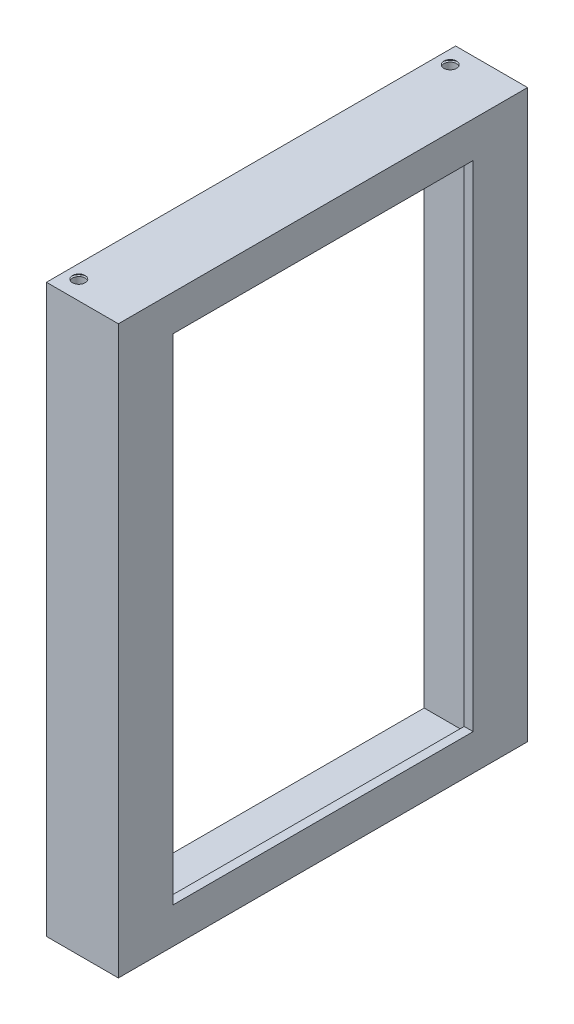
ISO-10303-21;
HEADER;
FILE_DESCRIPTION(('STEP AP214'),'2;1');
FILE_NAME('part.step','',(''),(''),'','','');
FILE_SCHEMA(('AUTOMOTIVE_DESIGN { 1 0 10303 214 1 1 1 1 }'));
ENDSEC;
DATA;
#1=APPLICATION_CONTEXT('core data for automotive mechanical design processes');
#2=APPLICATION_PROTOCOL_DEFINITION('international standard','automotive_design',2000,#1);
#3=PRODUCT_CONTEXT('',#1,'mechanical');
#4=PRODUCT('Part','Part','',(#3));
#5=PRODUCT_RELATED_PRODUCT_CATEGORY('part','',(#4));
#6=PRODUCT_DEFINITION_FORMATION('','',#4);
#7=PRODUCT_DEFINITION_CONTEXT('part definition',#1,'design');
#8=PRODUCT_DEFINITION('design','',#6,#7);
#9=PRODUCT_DEFINITION_SHAPE('','',#8);
#10=(LENGTH_UNIT() NAMED_UNIT(*) SI_UNIT(.MILLI.,.METRE.));
#11=(NAMED_UNIT(*) PLANE_ANGLE_UNIT() SI_UNIT($,.RADIAN.));
#12=(NAMED_UNIT(*) SI_UNIT($,.STERADIAN.) SOLID_ANGLE_UNIT());
#13=UNCERTAINTY_MEASURE_WITH_UNIT(LENGTH_MEASURE(1.E-05),#10,'distance_accuracy_value','');
#14=(GEOMETRIC_REPRESENTATION_CONTEXT(3) GLOBAL_UNCERTAINTY_ASSIGNED_CONTEXT((#13)) GLOBAL_UNIT_ASSIGNED_CONTEXT((#10,
#11,#12)) REPRESENTATION_CONTEXT('',''));
#15=CARTESIAN_POINT('',(0.,0.,0.));
#16=DIRECTION('',(0.,0.,1.));
#17=DIRECTION('',(1.,0.,0.));
#18=AXIS2_PLACEMENT_3D('',#15,#16,#17);
#19=CARTESIAN_POINT('',(-13.,53.99,86.8));
#20=DIRECTION('',(0.,1.,0.));
#21=DIRECTION('',(1.,0.,0.));
#22=AXIS2_PLACEMENT_3D('',#19,#20,#21);
#23=PLANE('',#22);
#24=CARTESIAN_POINT('',(-13.,53.99,86.8));
#25=DIRECTION('',(0.,1.,0.));
#26=DIRECTION('',(1.,0.,0.));
#27=AXIS2_PLACEMENT_3D('',#24,#25,#26);
#28=CIRCLE('',#27,1.4);
#29=CARTESIAN_POINT('',(-11.6,53.99,86.8));
#30=VERTEX_POINT('',#29);
#31=EDGE_CURVE('E9',#30,#30,#28,.T.);
#32=ORIENTED_EDGE('',*,*,#31,.T.);
#33=EDGE_LOOP('',(#32));
#34=FACE_BOUND('',#33,.T.);
#35=ADVANCED_FACE('F14',(#34),#23,.T.);
#36=CARTESIAN_POINT('',(-13.,53.99,4.2));
#37=DIRECTION('',(0.,1.,0.));
#38=DIRECTION('',(1.,0.,0.));
#39=AXIS2_PLACEMENT_3D('',#36,#37,#38);
#40=PLANE('',#39);
#41=CARTESIAN_POINT('',(-13.,53.99,4.2));
#42=DIRECTION('',(0.,1.,0.));
#43=DIRECTION('',(1.,0.,0.));
#44=AXIS2_PLACEMENT_3D('',#41,#42,#43);
#45=CIRCLE('',#44,1.4);
#46=CARTESIAN_POINT('',(-11.6,53.99,4.2));
#47=VERTEX_POINT('',#46);
#48=EDGE_CURVE('E371',#47,#47,#45,.T.);
#49=ORIENTED_EDGE('',*,*,#48,.T.);
#50=EDGE_LOOP('',(#49));
#51=FACE_BOUND('',#50,.T.);
#52=ADVANCED_FACE('F615',(#51),#40,.T.);
#53=CARTESIAN_POINT('',(-13.,-53.99,86.8));
#54=DIRECTION('',(0.,-1.,0.));
#55=DIRECTION('',(0.,0.,-1.));
#56=AXIS2_PLACEMENT_3D('',#53,#54,#55);
#57=PLANE('',#56);
#58=CARTESIAN_POINT('',(-13.,-53.99,86.8));
#59=DIRECTION('',(0.,-1.,0.));
#60=DIRECTION('',(1.,0.,0.));
#61=AXIS2_PLACEMENT_3D('',#58,#59,#60);
#62=CIRCLE('',#61,1.4);
#63=CARTESIAN_POINT('',(-11.6,-53.99,86.8));
#64=VERTEX_POINT('',#63);
#65=EDGE_CURVE('E200',#64,#64,#62,.T.);
#66=ORIENTED_EDGE('',*,*,#65,.T.);
#67=EDGE_LOOP('',(#66));
#68=FACE_BOUND('',#67,.T.);
#69=ADVANCED_FACE('F620',(#68),#57,.T.);
#70=CARTESIAN_POINT('',(-13.,-53.99,4.2));
#71=DIRECTION('',(0.,-1.,0.));
#72=DIRECTION('',(0.,0.,-1.));
#73=AXIS2_PLACEMENT_3D('',#70,#71,#72);
#74=PLANE('',#73);
#75=CARTESIAN_POINT('',(-13.,-53.99,4.2));
#76=DIRECTION('',(0.,-1.,0.));
#77=DIRECTION('',(1.,0.,0.));
#78=AXIS2_PLACEMENT_3D('',#75,#76,#77);
#79=CIRCLE('',#78,1.4);
#80=CARTESIAN_POINT('',(-11.6,-53.99,4.2));
#81=VERTEX_POINT('',#80);
#82=EDGE_CURVE('E191',#81,#81,#79,.T.);
#83=ORIENTED_EDGE('',*,*,#82,.T.);
#84=EDGE_LOOP('',(#83));
#85=FACE_BOUND('',#84,.T.);
#86=ADVANCED_FACE('F716',(#85),#74,.T.);
#87=CARTESIAN_POINT('',(-5.99,-35.,86.8));
#88=DIRECTION('',(-1.,0.,0.));
#89=DIRECTION('',(0.,0.,1.));
#90=AXIS2_PLACEMENT_3D('',#87,#88,#89);
#91=PLANE('',#90);
#92=CARTESIAN_POINT('',(-5.99,-35.,86.8));
#93=DIRECTION('',(-1.,0.,0.));
#94=DIRECTION('',(0.,0.,1.));
#95=AXIS2_PLACEMENT_3D('',#92,#93,#94);
#96=CIRCLE('',#95,1.4);
#97=CARTESIAN_POINT('',(-5.99,-35.,88.2));
#98=VERTEX_POINT('',#97);
#99=EDGE_CURVE('E275',#98,#98,#96,.T.);
#100=ORIENTED_EDGE('',*,*,#99,.T.);
#101=EDGE_LOOP('',(#100));
#102=FACE_BOUND('',#101,.T.);
#103=ADVANCED_FACE('F712',(#102),#91,.T.);
#104=CARTESIAN_POINT('',(-5.99,-35.,4.2));
#105=DIRECTION('',(-1.,0.,0.));
#106=DIRECTION('',(0.,0.,1.));
#107=AXIS2_PLACEMENT_3D('',#104,#105,#106);
#108=PLANE('',#107);
#109=CARTESIAN_POINT('',(-5.99,-35.,4.2));
#110=DIRECTION('',(-1.,0.,0.));
#111=DIRECTION('',(0.,0.,1.));
#112=AXIS2_PLACEMENT_3D('',#109,#110,#111);
#113=CIRCLE('',#112,1.4);
#114=CARTESIAN_POINT('',(-5.99,-35.,5.6));
#115=VERTEX_POINT('',#114);
#116=EDGE_CURVE('E304',#115,#115,#113,.T.);
#117=ORIENTED_EDGE('',*,*,#116,.T.);
#118=EDGE_LOOP('',(#117));
#119=FACE_BOUND('',#118,.T.);
#120=ADVANCED_FACE('F715',(#119),#108,.T.);
#121=CARTESIAN_POINT('',(-5.99,35.,86.8));
#122=DIRECTION('',(-1.,0.,0.));
#123=DIRECTION('',(0.,0.,1.));
#124=AXIS2_PLACEMENT_3D('',#121,#122,#123);
#125=PLANE('',#124);
#126=CARTESIAN_POINT('',(-5.99,35.,86.8));
#127=DIRECTION('',(-1.,0.,0.));
#128=DIRECTION('',(0.,0.,1.));
#129=AXIS2_PLACEMENT_3D('',#126,#127,#128);
#130=CIRCLE('',#129,1.4);
#131=CARTESIAN_POINT('',(-5.99,35.,88.2));
#132=VERTEX_POINT('',#131);
#133=EDGE_CURVE('E305',#132,#132,#130,.T.);
#134=ORIENTED_EDGE('',*,*,#133,.T.);
#135=EDGE_LOOP('',(#134));
#136=FACE_BOUND('',#135,.T.);
#137=ADVANCED_FACE('F652',(#136),#125,.T.);
#138=CARTESIAN_POINT('',(-5.99,35.,4.2));
#139=DIRECTION('',(-1.,0.,0.));
#140=DIRECTION('',(0.,0.,1.));
#141=AXIS2_PLACEMENT_3D('',#138,#139,#140);
#142=PLANE('',#141);
#143=CARTESIAN_POINT('',(-5.99,35.,4.2));
#144=DIRECTION('',(-1.,0.,0.));
#145=DIRECTION('',(0.,0.,1.));
#146=AXIS2_PLACEMENT_3D('',#143,#144,#145);
#147=CIRCLE('',#146,1.4);
#148=CARTESIAN_POINT('',(-5.99,35.,5.6));
#149=VERTEX_POINT('',#148);
#150=EDGE_CURVE('E18',#149,#149,#147,.T.);
#151=ORIENTED_EDGE('',*,*,#150,.T.);
#152=EDGE_LOOP('',(#151));
#153=FACE_BOUND('',#152,.T.);
#154=ADVANCED_FACE('F16',(#153),#142,.T.);
#155=CARTESIAN_POINT('',(-13.,53.99,86.8));
#156=DIRECTION('',(0.,1.,0.));
#157=DIRECTION('',(1.,0.,0.));
#158=AXIS2_PLACEMENT_3D('',#155,#156,#157);
#159=CYLINDRICAL_SURFACE('',#158,1.4);
#160=DIRECTION('',(0.,1.,0.));
#161=VECTOR('',#160,1.);
#162=CARTESIAN_POINT('',(-11.6,53.99,86.8));
#163=LINE('',#162,#161);
#164=CARTESIAN_POINT('',(-11.6,62.51,86.8));
#165=VERTEX_POINT('',#164);
#166=EDGE_CURVE('E25',#30,#165,#163,.T.);
#167=ORIENTED_EDGE('',*,*,#166,.F.);
#168=ORIENTED_EDGE('',*,*,#31,.F.);
#169=ORIENTED_EDGE('',*,*,#166,.T.);
#170=CARTESIAN_POINT('',(-13.,62.51,86.8));
#171=DIRECTION('',(0.,1.,0.));
#172=DIRECTION('',(1.,0.,0.));
#173=AXIS2_PLACEMENT_3D('',#170,#171,#172);
#174=CIRCLE('',#173,1.4);
#175=EDGE_CURVE('E337',#165,#165,#174,.T.);
#176=ORIENTED_EDGE('',*,*,#175,.T.);
#177=EDGE_LOOP('',(#167,#168,#169,#176));
#178=FACE_BOUND('',#177,.T.);
#179=ADVANCED_FACE('F643',(#178),#159,.F.);
#180=CARTESIAN_POINT('',(-13.,53.99,4.2));
#181=DIRECTION('',(0.,1.,0.));
#182=DIRECTION('',(1.,0.,0.));
#183=AXIS2_PLACEMENT_3D('',#180,#181,#182);
#184=CYLINDRICAL_SURFACE('',#183,1.4);
#185=DIRECTION('',(0.,1.,0.));
#186=VECTOR('',#185,1.);
#187=CARTESIAN_POINT('',(-11.6,53.99,4.2));
#188=LINE('',#187,#186);
#189=CARTESIAN_POINT('',(-11.6,62.51,4.2));
#190=VERTEX_POINT('',#189);
#191=EDGE_CURVE('E368',#47,#190,#188,.T.);
#192=ORIENTED_EDGE('',*,*,#191,.F.);
#193=ORIENTED_EDGE('',*,*,#48,.F.);
#194=ORIENTED_EDGE('',*,*,#191,.T.);
#195=CARTESIAN_POINT('',(-13.,62.51,4.2));
#196=DIRECTION('',(0.,1.,0.));
#197=DIRECTION('',(1.,0.,0.));
#198=AXIS2_PLACEMENT_3D('',#195,#196,#197);
#199=CIRCLE('',#198,1.4);
#200=EDGE_CURVE('E403',#190,#190,#199,.T.);
#201=ORIENTED_EDGE('',*,*,#200,.T.);
#202=EDGE_LOOP('',(#192,#193,#194,#201));
#203=FACE_BOUND('',#202,.T.);
#204=ADVANCED_FACE('F629',(#203),#184,.F.);
#205=CARTESIAN_POINT('',(-13.,-53.99,86.8));
#206=DIRECTION('',(0.,-1.,0.));
#207=DIRECTION('',(1.,0.,0.));
#208=AXIS2_PLACEMENT_3D('',#205,#206,#207);
#209=CYLINDRICAL_SURFACE('',#208,1.4);
#210=DIRECTION('',(0.,-1.,0.));
#211=VECTOR('',#210,1.);
#212=CARTESIAN_POINT('',(-11.6,-53.99,86.8));
#213=LINE('',#212,#211);
#214=CARTESIAN_POINT('',(-11.6,-62.51,86.8));
#215=VERTEX_POINT('',#214);
#216=EDGE_CURVE('E282',#64,#215,#213,.T.);
#217=ORIENTED_EDGE('',*,*,#216,.F.);
#218=ORIENTED_EDGE('',*,*,#65,.F.);
#219=ORIENTED_EDGE('',*,*,#216,.T.);
#220=CARTESIAN_POINT('',(-13.,-62.51,86.8));
#221=DIRECTION('',(0.,-1.,0.));
#222=DIRECTION('',(1.,0.,0.));
#223=AXIS2_PLACEMENT_3D('',#220,#221,#222);
#224=CIRCLE('',#223,1.4);
#225=EDGE_CURVE('E472',#215,#215,#224,.T.);
#226=ORIENTED_EDGE('',*,*,#225,.T.);
#227=EDGE_LOOP('',(#217,#218,#219,#226));
#228=FACE_BOUND('',#227,.T.);
#229=ADVANCED_FACE('F627',(#228),#209,.F.);
#230=CARTESIAN_POINT('',(-13.,-53.99,4.2));
#231=DIRECTION('',(0.,-1.,0.));
#232=DIRECTION('',(1.,0.,0.));
#233=AXIS2_PLACEMENT_3D('',#230,#231,#232);
#234=CYLINDRICAL_SURFACE('',#233,1.4);
#235=DIRECTION('',(0.,-1.,0.));
#236=VECTOR('',#235,1.);
#237=CARTESIAN_POINT('',(-11.6,-53.99,4.2));
#238=LINE('',#237,#236);
#239=CARTESIAN_POINT('',(-11.6,-62.51,4.2));
#240=VERTEX_POINT('',#239);
#241=EDGE_CURVE('E270',#81,#240,#238,.T.);
#242=ORIENTED_EDGE('',*,*,#241,.F.);
#243=ORIENTED_EDGE('',*,*,#82,.F.);
#244=ORIENTED_EDGE('',*,*,#241,.T.);
#245=CARTESIAN_POINT('',(-13.,-62.51,4.2));
#246=DIRECTION('',(0.,-1.,0.));
#247=DIRECTION('',(1.,0.,0.));
#248=AXIS2_PLACEMENT_3D('',#245,#246,#247);
#249=CIRCLE('',#248,1.4);
#250=EDGE_CURVE('E273',#240,#240,#249,.T.);
#251=ORIENTED_EDGE('',*,*,#250,.T.);
#252=EDGE_LOOP('',(#242,#243,#244,#251));
#253=FACE_BOUND('',#252,.T.);
#254=ADVANCED_FACE('F271',(#253),#234,.F.);
#255=CARTESIAN_POINT('',(-5.99,-35.,86.8));
#256=DIRECTION('',(-1.,0.,0.));
#257=DIRECTION('',(0.,0.,1.));
#258=AXIS2_PLACEMENT_3D('',#255,#256,#257);
#259=CYLINDRICAL_SURFACE('',#258,1.4);
#260=DIRECTION('',(-1.,0.,0.));
#261=VECTOR('',#260,1.);
#262=CARTESIAN_POINT('',(-5.99,-35.,88.2));
#263=LINE('',#262,#261);
#264=CARTESIAN_POINT('',(-15.51,-35.,88.2));
#265=VERTEX_POINT('',#264);
#266=EDGE_CURVE('E284',#98,#265,#263,.T.);
#267=ORIENTED_EDGE('',*,*,#266,.F.);
#268=ORIENTED_EDGE('',*,*,#99,.F.);
#269=ORIENTED_EDGE('',*,*,#266,.T.);
#270=CARTESIAN_POINT('',(-15.51,-35.,86.8));
#271=DIRECTION('',(-1.,0.,0.));
#272=DIRECTION('',(0.,0.,1.));
#273=AXIS2_PLACEMENT_3D('',#270,#271,#272);
#274=CIRCLE('',#273,1.4);
#275=EDGE_CURVE('E328',#265,#265,#274,.T.);
#276=ORIENTED_EDGE('',*,*,#275,.T.);
#277=EDGE_LOOP('',(#267,#268,#269,#276));
#278=FACE_BOUND('',#277,.T.);
#279=ADVANCED_FACE('F625',(#278),#259,.F.);
#280=CARTESIAN_POINT('',(-5.99,-35.,4.2));
#281=DIRECTION('',(-1.,0.,0.));
#282=DIRECTION('',(0.,0.,1.));
#283=AXIS2_PLACEMENT_3D('',#280,#281,#282);
#284=CYLINDRICAL_SURFACE('',#283,1.4);
#285=DIRECTION('',(-1.,0.,0.));
#286=VECTOR('',#285,1.);
#287=CARTESIAN_POINT('',(-5.99,-35.,5.6));
#288=LINE('',#287,#286);
#289=CARTESIAN_POINT('',(-15.51,-35.,5.6));
#290=VERTEX_POINT('',#289);
#291=EDGE_CURVE('E301',#115,#290,#288,.T.);
#292=ORIENTED_EDGE('',*,*,#291,.F.);
#293=ORIENTED_EDGE('',*,*,#116,.F.);
#294=ORIENTED_EDGE('',*,*,#291,.T.);
#295=CARTESIAN_POINT('',(-15.51,-35.,4.2));
#296=DIRECTION('',(-1.,0.,0.));
#297=DIRECTION('',(0.,0.,1.));
#298=AXIS2_PLACEMENT_3D('',#295,#296,#297);
#299=CIRCLE('',#298,1.4);
#300=EDGE_CURVE('E329',#290,#290,#299,.T.);
#301=ORIENTED_EDGE('',*,*,#300,.T.);
#302=EDGE_LOOP('',(#292,#293,#294,#301));
#303=FACE_BOUND('',#302,.T.);
#304=ADVANCED_FACE('F754',(#303),#284,.F.);
#305=CARTESIAN_POINT('',(-5.99,35.,86.8));
#306=DIRECTION('',(-1.,0.,0.));
#307=DIRECTION('',(0.,0.,1.));
#308=AXIS2_PLACEMENT_3D('',#305,#306,#307);
#309=CYLINDRICAL_SURFACE('',#308,1.4);
#310=DIRECTION('',(-1.,0.,0.));
#311=VECTOR('',#310,1.);
#312=CARTESIAN_POINT('',(-5.99,35.,88.2));
#313=LINE('',#312,#311);
#314=CARTESIAN_POINT('',(-15.51,35.,88.2));
#315=VERTEX_POINT('',#314);
#316=EDGE_CURVE('E360',#132,#315,#313,.T.);
#317=ORIENTED_EDGE('',*,*,#316,.F.);
#318=ORIENTED_EDGE('',*,*,#133,.F.);
#319=ORIENTED_EDGE('',*,*,#316,.T.);
#320=CARTESIAN_POINT('',(-15.51,35.,86.8));
#321=DIRECTION('',(-1.,0.,0.));
#322=DIRECTION('',(0.,0.,1.));
#323=AXIS2_PLACEMENT_3D('',#320,#321,#322);
#324=CIRCLE('',#323,1.4);
#325=EDGE_CURVE('E333',#315,#315,#324,.T.);
#326=ORIENTED_EDGE('',*,*,#325,.T.);
#327=EDGE_LOOP('',(#317,#318,#319,#326));
#328=FACE_BOUND('',#327,.T.);
#329=ADVANCED_FACE('F708',(#328),#309,.F.);
#330=CARTESIAN_POINT('',(-5.99,35.,4.2));
#331=DIRECTION('',(-1.,0.,0.));
#332=DIRECTION('',(0.,0.,1.));
#333=AXIS2_PLACEMENT_3D('',#330,#331,#332);
#334=CYLINDRICAL_SURFACE('',#333,1.4);
#335=DIRECTION('',(-1.,0.,0.));
#336=VECTOR('',#335,1.);
#337=CARTESIAN_POINT('',(-5.99,35.,5.6));
#338=LINE('',#337,#336);
#339=CARTESIAN_POINT('',(-15.51,35.,5.6));
#340=VERTEX_POINT('',#339);
#341=EDGE_CURVE('E334',#149,#340,#338,.T.);
#342=ORIENTED_EDGE('',*,*,#341,.F.);
#343=ORIENTED_EDGE('',*,*,#150,.F.);
#344=ORIENTED_EDGE('',*,*,#341,.T.);
#345=CARTESIAN_POINT('',(-15.51,35.,4.2));
#346=DIRECTION('',(-1.,0.,0.));
#347=DIRECTION('',(0.,0.,1.));
#348=AXIS2_PLACEMENT_3D('',#345,#346,#347);
#349=CIRCLE('',#348,1.4);
#350=EDGE_CURVE('E422',#340,#340,#349,.T.);
#351=ORIENTED_EDGE('',*,*,#350,.T.);
#352=EDGE_LOOP('',(#342,#343,#344,#351));
#353=FACE_BOUND('',#352,.T.);
#354=ADVANCED_FACE('F700',(#353),#334,.F.);
#355=CARTESIAN_POINT('',(-13.,62.51,86.8));
#356=DIRECTION('',(0.,1.,0.));
#357=DIRECTION('',(1.,0.,0.));
#358=AXIS2_PLACEMENT_3D('',#355,#356,#357);
#359=PLANE('',#358);
#360=ORIENTED_EDGE('',*,*,#175,.F.);
#361=EDGE_LOOP('',(#360));
#362=FACE_BOUND('',#361,.T.);
#363=CARTESIAN_POINT('',(-13.,62.51,86.8));
#364=DIRECTION('',(0.,1.,0.));
#365=DIRECTION('',(1.,0.,0.));
#366=AXIS2_PLACEMENT_3D('',#363,#364,#365);
#367=CIRCLE('',#366,1.9);
#368=CARTESIAN_POINT('',(-11.1,62.51,86.8));
#369=VERTEX_POINT('',#368);
#370=EDGE_CURVE('E358',#369,#369,#367,.T.);
#371=ORIENTED_EDGE('',*,*,#370,.T.);
#372=EDGE_LOOP('',(#371));
#373=FACE_BOUND('',#372,.T.);
#374=ADVANCED_FACE('F568',(#362,#373),#359,.T.);
#375=CARTESIAN_POINT('',(-13.,62.51,4.2));
#376=DIRECTION('',(0.,1.,0.));
#377=DIRECTION('',(1.,0.,0.));
#378=AXIS2_PLACEMENT_3D('',#375,#376,#377);
#379=PLANE('',#378);
#380=ORIENTED_EDGE('',*,*,#200,.F.);
#381=EDGE_LOOP('',(#380));
#382=FACE_BOUND('',#381,.T.);
#383=CARTESIAN_POINT('',(-13.,62.51,4.2));
#384=DIRECTION('',(0.,1.,0.));
#385=DIRECTION('',(1.,0.,0.));
#386=AXIS2_PLACEMENT_3D('',#383,#384,#385);
#387=CIRCLE('',#386,1.9);
#388=CARTESIAN_POINT('',(-11.1,62.51,4.2));
#389=VERTEX_POINT('',#388);
#390=EDGE_CURVE('E359',#389,#389,#387,.T.);
#391=ORIENTED_EDGE('',*,*,#390,.T.);
#392=EDGE_LOOP('',(#391));
#393=FACE_BOUND('',#392,.T.);
#394=ADVANCED_FACE('F699',(#382,#393),#379,.T.);
#395=CARTESIAN_POINT('',(-13.,-62.51,86.8));
#396=DIRECTION('',(0.,-1.,0.));
#397=DIRECTION('',(0.,0.,-1.));
#398=AXIS2_PLACEMENT_3D('',#395,#396,#397);
#399=PLANE('',#398);
#400=ORIENTED_EDGE('',*,*,#225,.F.);
#401=EDGE_LOOP('',(#400));
#402=FACE_BOUND('',#401,.T.);
#403=CARTESIAN_POINT('',(-13.,-62.51,86.8));
#404=DIRECTION('',(0.,-1.,0.));
#405=DIRECTION('',(1.,0.,0.));
#406=AXIS2_PLACEMENT_3D('',#403,#404,#405);
#407=CIRCLE('',#406,1.9);
#408=CARTESIAN_POINT('',(-11.1,-62.51,86.8));
#409=VERTEX_POINT('',#408);
#410=EDGE_CURVE('E374',#409,#409,#407,.T.);
#411=ORIENTED_EDGE('',*,*,#410,.T.);
#412=EDGE_LOOP('',(#411));
#413=FACE_BOUND('',#412,.T.);
#414=ADVANCED_FACE('F641',(#402,#413),#399,.T.);
#415=CARTESIAN_POINT('',(-13.,-62.51,4.2));
#416=DIRECTION('',(0.,-1.,0.));
#417=DIRECTION('',(0.,0.,-1.));
#418=AXIS2_PLACEMENT_3D('',#415,#416,#417);
#419=PLANE('',#418);
#420=ORIENTED_EDGE('',*,*,#250,.F.);
#421=EDGE_LOOP('',(#420));
#422=FACE_BOUND('',#421,.T.);
#423=CARTESIAN_POINT('',(-13.,-62.51,4.2));
#424=DIRECTION('',(0.,-1.,0.));
#425=DIRECTION('',(1.,0.,0.));
#426=AXIS2_PLACEMENT_3D('',#423,#424,#425);
#427=CIRCLE('',#426,1.9);
#428=CARTESIAN_POINT('',(-11.1,-62.51,4.2));
#429=VERTEX_POINT('',#428);
#430=EDGE_CURVE('E393',#429,#429,#427,.T.);
#431=ORIENTED_EDGE('',*,*,#430,.T.);
#432=EDGE_LOOP('',(#431));
#433=FACE_BOUND('',#432,.T.);
#434=ADVANCED_FACE('F638',(#422,#433),#419,.T.);
#435=CARTESIAN_POINT('',(-3.,-55.,12.1));
#436=DIRECTION('',(0.,1.,0.));
#437=DIRECTION('',(1.,0.,0.));
#438=AXIS2_PLACEMENT_3D('',#435,#436,#437);
#439=PLANE('',#438);
#440=DIRECTION('',(1.,0.,0.));
#441=VECTOR('',#440,1.);
#442=CARTESIAN_POINT('',(-3.,-55.,12.1));
#443=LINE('',#442,#441);
#444=CARTESIAN_POINT('',(-2.,-55.,12.1));
#445=VERTEX_POINT('',#444);
#446=CARTESIAN_POINT('',(0.,-55.,12.1));
#447=VERTEX_POINT('',#446);
#448=EDGE_CURVE('E296',#445,#447,#443,.T.);
#449=ORIENTED_EDGE('',*,*,#448,.F.);
#450=DIRECTION('',(0.,0.,1.));
#451=VECTOR('',#450,1.);
#452=CARTESIAN_POINT('',(-2.,-55.,7.05));
#453=LINE('',#452,#451);
#454=CARTESIAN_POINT('',(-2.,-55.,78.9));
#455=VERTEX_POINT('',#454);
#456=EDGE_CURVE('E318',#445,#455,#453,.T.);
#457=ORIENTED_EDGE('',*,*,#456,.T.);
#458=DIRECTION('',(1.,0.,0.));
#459=VECTOR('',#458,1.);
#460=CARTESIAN_POINT('',(-3.,-55.,78.9));
#461=LINE('',#460,#459);
#462=CARTESIAN_POINT('',(0.,-55.,78.9));
#463=VERTEX_POINT('',#462);
#464=EDGE_CURVE('E390',#455,#463,#461,.T.);
#465=ORIENTED_EDGE('',*,*,#464,.T.);
#466=DIRECTION('',(0.,0.,1.));
#467=VECTOR('',#466,1.);
#468=CARTESIAN_POINT('',(0.,-55.,6.05));
#469=LINE('',#468,#467);
#470=EDGE_CURVE('E465',#447,#463,#469,.T.);
#471=ORIENTED_EDGE('',*,*,#470,.F.);
#472=EDGE_LOOP('',(#449,#457,#465,#471));
#473=FACE_BOUND('',#472,.T.);
#474=ADVANCED_FACE('F640',(#473),#439,.T.);
#475=CARTESIAN_POINT('',(-3.,-55.,78.9));
#476=DIRECTION('',(0.,0.,1.));
#477=DIRECTION('',(1.,0.,0.));
#478=AXIS2_PLACEMENT_3D('',#475,#476,#477);
#479=PLANE('',#478);
#480=DIRECTION('',(0.,-1.,0.));
#481=VECTOR('',#480,1.);
#482=CARTESIAN_POINT('',(0.,-59.,78.9));
#483=LINE('',#482,#481);
#484=CARTESIAN_POINT('',(0.,55.,78.9));
#485=VERTEX_POINT('',#484);
#486=EDGE_CURVE('E461',#485,#463,#483,.T.);
#487=ORIENTED_EDGE('',*,*,#486,.T.);
#488=ORIENTED_EDGE('',*,*,#464,.F.);
#489=DIRECTION('',(0.,-1.,0.));
#490=VECTOR('',#489,1.);
#491=CARTESIAN_POINT('',(-2.,-58.,78.9));
#492=LINE('',#491,#490);
#493=CARTESIAN_POINT('',(-2.,55.,78.9));
#494=VERTEX_POINT('',#493);
#495=EDGE_CURVE('E314',#494,#455,#492,.T.);
#496=ORIENTED_EDGE('',*,*,#495,.F.);
#497=DIRECTION('',(1.,0.,0.));
#498=VECTOR('',#497,1.);
#499=CARTESIAN_POINT('',(-3.,55.,78.9));
#500=LINE('',#499,#498);
#501=EDGE_CURVE('E299',#494,#485,#500,.T.);
#502=ORIENTED_EDGE('',*,*,#501,.T.);
#503=EDGE_LOOP('',(#487,#488,#496,#502));
#504=FACE_BOUND('',#503,.T.);
#505=ADVANCED_FACE('F770',(#504),#479,.F.);
#506=CARTESIAN_POINT('',(-3.,55.,12.1));
#507=DIRECTION('',(0.,1.,0.));
#508=DIRECTION('',(1.,0.,0.));
#509=AXIS2_PLACEMENT_3D('',#506,#507,#508);
#510=PLANE('',#509);
#511=DIRECTION('',(0.,0.,1.));
#512=VECTOR('',#511,1.);
#513=CARTESIAN_POINT('',(0.,55.,6.05));
#514=LINE('',#513,#512);
#515=CARTESIAN_POINT('',(0.,55.,12.1));
#516=VERTEX_POINT('',#515);
#517=EDGE_CURVE('E421',#516,#485,#514,.T.);
#518=ORIENTED_EDGE('',*,*,#517,.T.);
#519=ORIENTED_EDGE('',*,*,#501,.F.);
#520=DIRECTION('',(0.,0.,1.));
#521=VECTOR('',#520,1.);
#522=CARTESIAN_POINT('',(-2.,55.,7.05));
#523=LINE('',#522,#521);
#524=CARTESIAN_POINT('',(-2.,55.,12.1));
#525=VERTEX_POINT('',#524);
#526=EDGE_CURVE('E319',#525,#494,#523,.T.);
#527=ORIENTED_EDGE('',*,*,#526,.F.);
#528=DIRECTION('',(1.,0.,0.));
#529=VECTOR('',#528,1.);
#530=CARTESIAN_POINT('',(-3.,55.,12.1));
#531=LINE('',#530,#529);
#532=EDGE_CURVE('E300',#525,#516,#531,.T.);
#533=ORIENTED_EDGE('',*,*,#532,.T.);
#534=EDGE_LOOP('',(#518,#519,#527,#533));
#535=FACE_BOUND('',#534,.T.);
#536=ADVANCED_FACE('F772',(#535),#510,.F.);
#537=CARTESIAN_POINT('',(-3.,-55.,12.1));
#538=DIRECTION('',(0.,0.,1.));
#539=DIRECTION('',(1.,0.,0.));
#540=AXIS2_PLACEMENT_3D('',#537,#538,#539);
#541=PLANE('',#540);
#542=ORIENTED_EDGE('',*,*,#532,.F.);
#543=DIRECTION('',(0.,-1.,0.));
#544=VECTOR('',#543,1.);
#545=CARTESIAN_POINT('',(-2.,-58.,12.1));
#546=LINE('',#545,#544);
#547=EDGE_CURVE('E288',#525,#445,#546,.T.);
#548=ORIENTED_EDGE('',*,*,#547,.T.);
#549=ORIENTED_EDGE('',*,*,#448,.T.);
#550=DIRECTION('',(0.,-1.,0.));
#551=VECTOR('',#550,1.);
#552=CARTESIAN_POINT('',(0.,-59.,12.1));
#553=LINE('',#552,#551);
#554=EDGE_CURVE('E478',#516,#447,#553,.T.);
#555=ORIENTED_EDGE('',*,*,#554,.F.);
#556=EDGE_LOOP('',(#542,#548,#549,#555));
#557=FACE_BOUND('',#556,.T.);
#558=ADVANCED_FACE('F734',(#557),#541,.T.);
#559=CARTESIAN_POINT('',(-15.51,-35.,86.8));
#560=DIRECTION('',(-1.,0.,0.));
#561=DIRECTION('',(0.,0.,1.));
#562=AXIS2_PLACEMENT_3D('',#559,#560,#561);
#563=PLANE('',#562);
#564=ORIENTED_EDGE('',*,*,#275,.F.);
#565=EDGE_LOOP('',(#564));
#566=FACE_BOUND('',#565,.T.);
#567=CARTESIAN_POINT('',(-15.51,-35.,86.8));
#568=DIRECTION('',(-1.,0.,0.));
#569=DIRECTION('',(0.,0.,1.));
#570=AXIS2_PLACEMENT_3D('',#567,#568,#569);
#571=CIRCLE('',#570,1.9);
#572=CARTESIAN_POINT('',(-15.51,-35.,88.7));
#573=VERTEX_POINT('',#572);
#574=EDGE_CURVE('E353',#573,#573,#571,.T.);
#575=ORIENTED_EDGE('',*,*,#574,.T.);
#576=EDGE_LOOP('',(#575));
#577=FACE_BOUND('',#576,.T.);
#578=ADVANCED_FACE('F730',(#566,#577),#563,.T.);
#579=CARTESIAN_POINT('',(-2.,-61.,2.));
#580=DIRECTION('',(1.,0.,0.));
#581=DIRECTION('',(0.,1.,0.));
#582=AXIS2_PLACEMENT_3D('',#579,#580,#581);
#583=PLANE('',#582);
#584=ORIENTED_EDGE('',*,*,#526,.T.);
#585=ORIENTED_EDGE('',*,*,#495,.T.);
#586=ORIENTED_EDGE('',*,*,#456,.F.);
#587=ORIENTED_EDGE('',*,*,#547,.F.);
#588=EDGE_LOOP('',(#584,#585,#586,#587));
#589=FACE_BOUND('',#588,.T.);
#590=DIRECTION('',(0.,-1.,0.));
#591=VECTOR('',#590,1.);
#592=CARTESIAN_POINT('',(-2.,-61.005,84.));
#593=LINE('',#592,#591);
#594=CARTESIAN_POINT('',(-2.,61.,84.));
#595=VERTEX_POINT('',#594);
#596=CARTESIAN_POINT('',(-2.,-61.,84.));
#597=VERTEX_POINT('',#596);
#598=EDGE_CURVE('E389',#595,#597,#593,.T.);
#599=ORIENTED_EDGE('',*,*,#598,.F.);
#600=DIRECTION('',(0.,0.,1.));
#601=VECTOR('',#600,1.);
#602=CARTESIAN_POINT('',(-2.,61.,2.));
#603=LINE('',#602,#601);
#604=CARTESIAN_POINT('',(-2.,61.,7.));
#605=VERTEX_POINT('',#604);
#606=EDGE_CURVE('E320',#605,#595,#603,.T.);
#607=ORIENTED_EDGE('',*,*,#606,.F.);
#608=DIRECTION('',(0.,-1.,0.));
#609=VECTOR('',#608,1.);
#610=CARTESIAN_POINT('',(-2.,-61.005,7.));
#611=LINE('',#610,#609);
#612=CARTESIAN_POINT('',(-2.,-61.,7.));
#613=VERTEX_POINT('',#612);
#614=EDGE_CURVE('E383',#605,#613,#611,.T.);
#615=ORIENTED_EDGE('',*,*,#614,.T.);
#616=DIRECTION('',(0.,0.,1.));
#617=VECTOR('',#616,1.);
#618=CARTESIAN_POINT('',(-2.,-61.,2.));
#619=LINE('',#618,#617);
#620=EDGE_CURVE('E354',#613,#597,#619,.T.);
#621=ORIENTED_EDGE('',*,*,#620,.T.);
#622=EDGE_LOOP('',(#599,#607,#615,#621));
#623=FACE_BOUND('',#622,.T.);
#624=ADVANCED_FACE('F733',(#589,#623),#583,.F.);
#625=CARTESIAN_POINT('',(-15.51,-35.,4.2));
#626=DIRECTION('',(-1.,0.,0.));
#627=DIRECTION('',(0.,0.,1.));
#628=AXIS2_PLACEMENT_3D('',#625,#626,#627);
#629=PLANE('',#628);
#630=ORIENTED_EDGE('',*,*,#300,.F.);
#631=EDGE_LOOP('',(#630));
#632=FACE_BOUND('',#631,.T.);
#633=CARTESIAN_POINT('',(-15.51,-35.,4.2));
#634=DIRECTION('',(-1.,0.,0.));
#635=DIRECTION('',(0.,0.,1.));
#636=AXIS2_PLACEMENT_3D('',#633,#634,#635);
#637=CIRCLE('',#636,1.9);
#638=CARTESIAN_POINT('',(-15.51,-35.,6.1));
#639=VERTEX_POINT('',#638);
#640=EDGE_CURVE('E325',#639,#639,#637,.T.);
#641=ORIENTED_EDGE('',*,*,#640,.T.);
#642=EDGE_LOOP('',(#641));
#643=FACE_BOUND('',#642,.T.);
#644=ADVANCED_FACE('F711',(#632,#643),#629,.T.);
#645=CARTESIAN_POINT('',(-15.51,35.,86.8));
#646=DIRECTION('',(-1.,0.,0.));
#647=DIRECTION('',(0.,0.,1.));
#648=AXIS2_PLACEMENT_3D('',#645,#646,#647);
#649=PLANE('',#648);
#650=ORIENTED_EDGE('',*,*,#325,.F.);
#651=EDGE_LOOP('',(#650));
#652=FACE_BOUND('',#651,.T.);
#653=CARTESIAN_POINT('',(-15.51,35.,86.8));
#654=DIRECTION('',(-1.,0.,0.));
#655=DIRECTION('',(0.,0.,1.));
#656=AXIS2_PLACEMENT_3D('',#653,#654,#655);
#657=CIRCLE('',#656,1.9);
#658=CARTESIAN_POINT('',(-15.51,35.,88.7));
#659=VERTEX_POINT('',#658);
#660=EDGE_CURVE('E345',#659,#659,#657,.T.);
#661=ORIENTED_EDGE('',*,*,#660,.T.);
#662=EDGE_LOOP('',(#661));
#663=FACE_BOUND('',#662,.T.);
#664=ADVANCED_FACE('F740',(#652,#663),#649,.T.);
#665=CARTESIAN_POINT('',(-15.51,35.,4.2));
#666=DIRECTION('',(-1.,0.,0.));
#667=DIRECTION('',(0.,0.,1.));
#668=AXIS2_PLACEMENT_3D('',#665,#666,#667);
#669=PLANE('',#668);
#670=ORIENTED_EDGE('',*,*,#350,.F.);
#671=EDGE_LOOP('',(#670));
#672=FACE_BOUND('',#671,.T.);
#673=CARTESIAN_POINT('',(-15.51,35.,4.2));
#674=DIRECTION('',(-1.,0.,0.));
#675=DIRECTION('',(0.,0.,1.));
#676=AXIS2_PLACEMENT_3D('',#673,#674,#675);
#677=CIRCLE('',#676,1.9);
#678=CARTESIAN_POINT('',(-15.51,35.,6.1));
#679=VERTEX_POINT('',#678);
#680=EDGE_CURVE('E290',#679,#679,#677,.T.);
#681=ORIENTED_EDGE('',*,*,#680,.T.);
#682=EDGE_LOOP('',(#681));
#683=FACE_BOUND('',#682,.T.);
#684=ADVANCED_FACE('F743',(#672,#683),#669,.T.);
#685=CARTESIAN_POINT('',(-13.,62.51,86.8));
#686=DIRECTION('',(0.,-1.,0.));
#687=DIRECTION('',(1.,0.,0.));
#688=AXIS2_PLACEMENT_3D('',#685,#686,#687);
#689=CONICAL_SURFACE('',#688,1.9,0.785398163397);
#690=DIRECTION('',(-0.707106781186548,0.707106781186548,0.));
#691=VECTOR('',#690,1.);
#692=CARTESIAN_POINT('',(-11.1,62.51,86.8));
#693=LINE('',#692,#691);
#694=CARTESIAN_POINT('',(-11.59,63.,86.8));
#695=VERTEX_POINT('',#694);
#696=EDGE_CURVE('E355',#369,#695,#693,.T.);
#697=ORIENTED_EDGE('',*,*,#696,.F.);
#698=ORIENTED_EDGE('',*,*,#370,.F.);
#699=ORIENTED_EDGE('',*,*,#696,.T.);
#700=CARTESIAN_POINT('',(-13.,63.,86.8));
#701=DIRECTION('',(0.,1.,0.));
#702=DIRECTION('',(1.,0.,0.));
#703=AXIS2_PLACEMENT_3D('',#700,#701,#702);
#704=CIRCLE('',#703,1.41);
#705=EDGE_CURVE('E310',#695,#695,#704,.T.);
#706=ORIENTED_EDGE('',*,*,#705,.T.);
#707=EDGE_LOOP('',(#697,#698,#699,#706));
#708=FACE_BOUND('',#707,.T.);
#709=ADVANCED_FACE('F571',(#708),#689,.F.);
#710=CARTESIAN_POINT('',(-13.,62.51,4.2));
#711=DIRECTION('',(0.,-1.,0.));
#712=DIRECTION('',(1.,0.,0.));
#713=AXIS2_PLACEMENT_3D('',#710,#711,#712);
#714=CONICAL_SURFACE('',#713,1.9,0.785398163397);
#715=DIRECTION('',(-0.707106781186548,0.707106781186548,0.));
#716=VECTOR('',#715,1.);
#717=CARTESIAN_POINT('',(-11.1,62.51,4.2));
#718=LINE('',#717,#716);
#719=CARTESIAN_POINT('',(-11.59,63.,4.2));
#720=VERTEX_POINT('',#719);
#721=EDGE_CURVE('E377',#389,#720,#718,.T.);
#722=ORIENTED_EDGE('',*,*,#721,.F.);
#723=ORIENTED_EDGE('',*,*,#390,.F.);
#724=ORIENTED_EDGE('',*,*,#721,.T.);
#725=CARTESIAN_POINT('',(-13.,63.,4.2));
#726=DIRECTION('',(0.,1.,0.));
#727=DIRECTION('',(1.,0.,0.));
#728=AXIS2_PLACEMENT_3D('',#725,#726,#727);
#729=CIRCLE('',#728,1.41);
#730=EDGE_CURVE('E306',#720,#720,#729,.T.);
#731=ORIENTED_EDGE('',*,*,#730,.T.);
#732=EDGE_LOOP('',(#722,#723,#724,#731));
#733=FACE_BOUND('',#732,.T.);
#734=ADVANCED_FACE('F738',(#733),#714,.F.);
#735=CARTESIAN_POINT('',(-13.,-62.51,86.8));
#736=DIRECTION('',(0.,1.,0.));
#737=DIRECTION('',(1.,0.,0.));
#738=AXIS2_PLACEMENT_3D('',#735,#736,#737);
#739=CONICAL_SURFACE('',#738,1.9,0.785398163397);
#740=DIRECTION('',(-0.707106781186548,-0.707106781186548,0.));
#741=VECTOR('',#740,1.);
#742=CARTESIAN_POINT('',(-11.1,-62.51,86.8));
#743=LINE('',#742,#741);
#744=CARTESIAN_POINT('',(-11.59,-63.,86.8));
#745=VERTEX_POINT('',#744);
#746=EDGE_CURVE('E378',#409,#745,#743,.T.);
#747=ORIENTED_EDGE('',*,*,#746,.F.);
#748=ORIENTED_EDGE('',*,*,#410,.F.);
#749=ORIENTED_EDGE('',*,*,#746,.T.);
#750=CARTESIAN_POINT('',(-13.,-63.,86.8));
#751=DIRECTION('',(0.,-1.,0.));
#752=DIRECTION('',(1.,0.,0.));
#753=AXIS2_PLACEMENT_3D('',#750,#751,#752);
#754=CIRCLE('',#753,1.41);
#755=EDGE_CURVE('E341',#745,#745,#754,.T.);
#756=ORIENTED_EDGE('',*,*,#755,.T.);
#757=EDGE_LOOP('',(#747,#748,#749,#756));
#758=FACE_BOUND('',#757,.T.);
#759=ADVANCED_FACE('F609',(#758),#739,.F.);
#760=CARTESIAN_POINT('',(-13.,-62.51,4.2));
#761=DIRECTION('',(0.,1.,0.));
#762=DIRECTION('',(1.,0.,0.));
#763=AXIS2_PLACEMENT_3D('',#760,#761,#762);
#764=CONICAL_SURFACE('',#763,1.9,0.785398163397);
#765=DIRECTION('',(-0.707106781186548,-0.707106781186548,0.));
#766=VECTOR('',#765,1.);
#767=CARTESIAN_POINT('',(-11.1,-62.51,4.2));
#768=LINE('',#767,#766);
#769=CARTESIAN_POINT('',(-11.59,-63.,4.2));
#770=VERTEX_POINT('',#769);
#771=EDGE_CURVE('E396',#429,#770,#768,.T.);
#772=ORIENTED_EDGE('',*,*,#771,.F.);
#773=ORIENTED_EDGE('',*,*,#430,.F.);
#774=ORIENTED_EDGE('',*,*,#771,.T.);
#775=CARTESIAN_POINT('',(-13.,-63.,4.2));
#776=DIRECTION('',(0.,-1.,0.));
#777=DIRECTION('',(1.,0.,0.));
#778=AXIS2_PLACEMENT_3D('',#775,#776,#777);
#779=CIRCLE('',#778,1.41);
#780=EDGE_CURVE('E366',#770,#770,#779,.T.);
#781=ORIENTED_EDGE('',*,*,#780,.T.);
#782=EDGE_LOOP('',(#772,#773,#774,#781));
#783=FACE_BOUND('',#782,.T.);
#784=ADVANCED_FACE('F598',(#783),#764,.F.);
#785=CARTESIAN_POINT('',(0.,-63.,0.));
#786=DIRECTION('',(1.,0.,0.));
#787=DIRECTION('',(0.,1.,0.));
#788=AXIS2_PLACEMENT_3D('',#785,#786,#787);
#789=PLANE('',#788);
#790=ORIENTED_EDGE('',*,*,#554,.T.);
#791=ORIENTED_EDGE('',*,*,#470,.T.);
#792=ORIENTED_EDGE('',*,*,#486,.F.);
#793=ORIENTED_EDGE('',*,*,#517,.F.);
#794=EDGE_LOOP('',(#790,#791,#792,#793));
#795=FACE_BOUND('',#794,.T.);
#796=DIRECTION('',(0.,0.,1.));
#797=VECTOR('',#796,1.);
#798=CARTESIAN_POINT('',(0.,-63.,0.));
#799=LINE('',#798,#797);
#800=CARTESIAN_POINT('',(0.,-63.,0.));
#801=VERTEX_POINT('',#800);
#802=CARTESIAN_POINT('',(0.,-63.,91.));
#803=VERTEX_POINT('',#802);
#804=EDGE_CURVE('E408',#801,#803,#799,.T.);
#805=ORIENTED_EDGE('',*,*,#804,.F.);
#806=DIRECTION('',(0.,1.,0.));
#807=VECTOR('',#806,1.);
#808=CARTESIAN_POINT('',(0.,-63.,0.));
#809=LINE('',#808,#807);
#810=CARTESIAN_POINT('',(0.,63.,0.));
#811=VERTEX_POINT('',#810);
#812=EDGE_CURVE('E225',#801,#811,#809,.T.);
#813=ORIENTED_EDGE('',*,*,#812,.T.);
#814=DIRECTION('',(0.,0.,1.));
#815=VECTOR('',#814,1.);
#816=CARTESIAN_POINT('',(0.,63.,0.));
#817=LINE('',#816,#815);
#818=CARTESIAN_POINT('',(0.,63.,91.));
#819=VERTEX_POINT('',#818);
#820=EDGE_CURVE('E311',#811,#819,#817,.T.);
#821=ORIENTED_EDGE('',*,*,#820,.T.);
#822=DIRECTION('',(0.,1.,0.));
#823=VECTOR('',#822,1.);
#824=CARTESIAN_POINT('',(0.,-63.,91.));
#825=LINE('',#824,#823);
#826=EDGE_CURVE('E236',#803,#819,#825,.T.);
#827=ORIENTED_EDGE('',*,*,#826,.F.);
#828=EDGE_LOOP('',(#805,#813,#821,#827));
#829=FACE_BOUND('',#828,.T.);
#830=ADVANCED_FACE('F595',(#795,#829),#789,.T.);
#831=CARTESIAN_POINT('',(-15.51,-35.,86.8));
#832=DIRECTION('',(1.,0.,0.));
#833=DIRECTION('',(0.,0.,1.));
#834=AXIS2_PLACEMENT_3D('',#831,#832,#833);
#835=CONICAL_SURFACE('',#834,1.9,0.785398163397);
#836=DIRECTION('',(-0.707106781186548,0.,-0.707106781186548));
#837=VECTOR('',#836,1.);
#838=CARTESIAN_POINT('',(-15.51,-35.,88.7));
#839=LINE('',#838,#837);
#840=CARTESIAN_POINT('',(-16.,-35.,88.21));
#841=VERTEX_POINT('',#840);
#842=EDGE_CURVE('E350',#573,#841,#839,.T.);
#843=ORIENTED_EDGE('',*,*,#842,.F.);
#844=ORIENTED_EDGE('',*,*,#574,.F.);
#845=ORIENTED_EDGE('',*,*,#842,.T.);
#846=CARTESIAN_POINT('',(-16.,-35.,86.8));
#847=DIRECTION('',(-1.,0.,0.));
#848=DIRECTION('',(0.,0.,1.));
#849=AXIS2_PLACEMENT_3D('',#846,#847,#848);
#850=CIRCLE('',#849,1.41);
#851=EDGE_CURVE('E404',#841,#841,#850,.T.);
#852=ORIENTED_EDGE('',*,*,#851,.T.);
#853=EDGE_LOOP('',(#843,#844,#845,#852));
#854=FACE_BOUND('',#853,.T.);
#855=ADVANCED_FACE('F597',(#854),#835,.F.);
#856=CARTESIAN_POINT('',(-17.,-61.,2.));
#857=DIRECTION('',(0.,1.,0.));
#858=DIRECTION('',(1.,0.,0.));
#859=AXIS2_PLACEMENT_3D('',#856,#857,#858);
#860=PLANE('',#859);
#861=DIRECTION('',(1.,0.,0.));
#862=VECTOR('',#861,1.);
#863=CARTESIAN_POINT('',(-16.5,-61.,7.));
#864=LINE('',#863,#862);
#865=CARTESIAN_POINT('',(-16.,-61.,7.));
#866=VERTEX_POINT('',#865);
#867=EDGE_CURVE('E379',#866,#613,#864,.T.);
#868=ORIENTED_EDGE('',*,*,#867,.F.);
#869=DIRECTION('',(0.,0.,1.));
#870=VECTOR('',#869,1.);
#871=CARTESIAN_POINT('',(-16.,-61.,1.));
#872=LINE('',#871,#870);
#873=CARTESIAN_POINT('',(-16.,-61.,84.));
#874=VERTEX_POINT('',#873);
#875=EDGE_CURVE('E413',#866,#874,#872,.T.);
#876=ORIENTED_EDGE('',*,*,#875,.T.);
#877=DIRECTION('',(1.,0.,0.));
#878=VECTOR('',#877,1.);
#879=CARTESIAN_POINT('',(-16.5,-61.,84.));
#880=LINE('',#879,#878);
#881=EDGE_CURVE('E385',#874,#597,#880,.T.);
#882=ORIENTED_EDGE('',*,*,#881,.T.);
#883=ORIENTED_EDGE('',*,*,#620,.F.);
#884=EDGE_LOOP('',(#868,#876,#882,#883));
#885=FACE_BOUND('',#884,.T.);
#886=ADVANCED_FACE('F606',(#885),#860,.T.);
#887=CARTESIAN_POINT('',(-16.,-61.01,84.));
#888=DIRECTION('',(0.,0.,1.));
#889=DIRECTION('',(1.,0.,0.));
#890=AXIS2_PLACEMENT_3D('',#887,#888,#889);
#891=PLANE('',#890);
#892=DIRECTION('',(1.,0.,0.));
#893=VECTOR('',#892,1.);
#894=CARTESIAN_POINT('',(-16.5,61.,84.));
#895=LINE('',#894,#893);
#896=CARTESIAN_POINT('',(-16.,61.,84.));
#897=VERTEX_POINT('',#896);
#898=EDGE_CURVE('E324',#897,#595,#895,.T.);
#899=ORIENTED_EDGE('',*,*,#898,.T.);
#900=ORIENTED_EDGE('',*,*,#598,.T.);
#901=ORIENTED_EDGE('',*,*,#881,.F.);
#902=DIRECTION('',(0.,1.,0.));
#903=VECTOR('',#902,1.);
#904=CARTESIAN_POINT('',(-16.,-61.01,84.));
#905=LINE('',#904,#903);
#906=EDGE_CURVE('E418',#874,#897,#905,.T.);
#907=ORIENTED_EDGE('',*,*,#906,.T.);
#908=EDGE_LOOP('',(#899,#900,#901,#907));
#909=FACE_BOUND('',#908,.T.);
#910=ADVANCED_FACE('F780',(#909),#891,.F.);
#911=CARTESIAN_POINT('',(-16.,-61.01,7.));
#912=DIRECTION('',(0.,0.,1.));
#913=DIRECTION('',(1.,0.,0.));
#914=AXIS2_PLACEMENT_3D('',#911,#912,#913);
#915=PLANE('',#914);
#916=DIRECTION('',(0.,1.,0.));
#917=VECTOR('',#916,1.);
#918=CARTESIAN_POINT('',(-16.,-61.01,7.));
#919=LINE('',#918,#917);
#920=CARTESIAN_POINT('',(-16.,61.,7.));
#921=VERTEX_POINT('',#920);
#922=EDGE_CURVE('E417',#866,#921,#919,.T.);
#923=ORIENTED_EDGE('',*,*,#922,.F.);
#924=ORIENTED_EDGE('',*,*,#867,.T.);
#925=ORIENTED_EDGE('',*,*,#614,.F.);
#926=DIRECTION('',(1.,0.,0.));
#927=VECTOR('',#926,1.);
#928=CARTESIAN_POINT('',(-16.5,61.,7.));
#929=LINE('',#928,#927);
#930=EDGE_CURVE('E384',#921,#605,#929,.T.);
#931=ORIENTED_EDGE('',*,*,#930,.F.);
#932=EDGE_LOOP('',(#923,#924,#925,#931));
#933=FACE_BOUND('',#932,.T.);
#934=ADVANCED_FACE('F748',(#933),#915,.T.);
#935=CARTESIAN_POINT('',(-17.,61.,2.));
#936=DIRECTION('',(0.,1.,0.));
#937=DIRECTION('',(1.,0.,0.));
#938=AXIS2_PLACEMENT_3D('',#935,#936,#937);
#939=PLANE('',#938);
#940=ORIENTED_EDGE('',*,*,#606,.T.);
#941=ORIENTED_EDGE('',*,*,#898,.F.);
#942=DIRECTION('',(0.,0.,1.));
#943=VECTOR('',#942,1.);
#944=CARTESIAN_POINT('',(-16.,61.,1.));
#945=LINE('',#944,#943);
#946=EDGE_CURVE('E409',#921,#897,#945,.T.);
#947=ORIENTED_EDGE('',*,*,#946,.F.);
#948=ORIENTED_EDGE('',*,*,#930,.T.);
#949=EDGE_LOOP('',(#940,#941,#947,#948));
#950=FACE_BOUND('',#949,.T.);
#951=ADVANCED_FACE('F745',(#950),#939,.F.);
#952=CARTESIAN_POINT('',(-15.51,-35.,4.2));
#953=DIRECTION('',(1.,0.,0.));
#954=DIRECTION('',(0.,0.,1.));
#955=AXIS2_PLACEMENT_3D('',#952,#953,#954);
#956=CONICAL_SURFACE('',#955,1.9,0.785398163397);
#957=DIRECTION('',(-0.707106781186548,0.,-0.707106781186548));
#958=VECTOR('',#957,1.);
#959=CARTESIAN_POINT('',(-15.51,-35.,6.1));
#960=LINE('',#959,#958);
#961=CARTESIAN_POINT('',(-16.,-35.,5.61));
#962=VERTEX_POINT('',#961);
#963=EDGE_CURVE('E342',#639,#962,#960,.T.);
#964=ORIENTED_EDGE('',*,*,#963,.F.);
#965=ORIENTED_EDGE('',*,*,#640,.F.);
#966=ORIENTED_EDGE('',*,*,#963,.T.);
#967=CARTESIAN_POINT('',(-16.,-35.,4.2));
#968=DIRECTION('',(-1.,0.,0.));
#969=DIRECTION('',(0.,0.,1.));
#970=AXIS2_PLACEMENT_3D('',#967,#968,#969);
#971=CIRCLE('',#970,1.41);
#972=EDGE_CURVE('E438',#962,#962,#971,.T.);
#973=ORIENTED_EDGE('',*,*,#972,.T.);
#974=EDGE_LOOP('',(#964,#965,#966,#973));
#975=FACE_BOUND('',#974,.T.);
#976=ADVANCED_FACE('F720',(#975),#956,.F.);
#977=CARTESIAN_POINT('',(-15.51,35.,86.8));
#978=DIRECTION('',(1.,0.,0.));
#979=DIRECTION('',(0.,0.,1.));
#980=AXIS2_PLACEMENT_3D('',#977,#978,#979);
#981=CONICAL_SURFACE('',#980,1.9,0.785398163397);
#982=DIRECTION('',(-0.707106781186548,0.,-0.707106781186548));
#983=VECTOR('',#982,1.);
#984=CARTESIAN_POINT('',(-15.51,35.,88.7));
#985=LINE('',#984,#983);
#986=CARTESIAN_POINT('',(-16.,35.,88.21));
#987=VERTEX_POINT('',#986);
#988=EDGE_CURVE('E294',#659,#987,#985,.T.);
#989=ORIENTED_EDGE('',*,*,#988,.F.);
#990=ORIENTED_EDGE('',*,*,#660,.F.);
#991=ORIENTED_EDGE('',*,*,#988,.T.);
#992=CARTESIAN_POINT('',(-16.,35.,86.8));
#993=DIRECTION('',(-1.,0.,0.));
#994=DIRECTION('',(0.,0.,1.));
#995=AXIS2_PLACEMENT_3D('',#992,#993,#994);
#996=CIRCLE('',#995,1.41);
#997=EDGE_CURVE('E442',#987,#987,#996,.T.);
#998=ORIENTED_EDGE('',*,*,#997,.T.);
#999=EDGE_LOOP('',(#989,#990,#991,#998));
#1000=FACE_BOUND('',#999,.T.);
#1001=ADVANCED_FACE('F635',(#1000),#981,.F.);
#1002=CARTESIAN_POINT('',(-15.51,35.,4.2));
#1003=DIRECTION('',(1.,0.,0.));
#1004=DIRECTION('',(0.,0.,1.));
#1005=AXIS2_PLACEMENT_3D('',#1002,#1003,#1004);
#1006=CONICAL_SURFACE('',#1005,1.9,0.785398163397);
#1007=DIRECTION('',(-0.707106781186548,0.,-0.707106781186548));
#1008=VECTOR('',#1007,1.);
#1009=CARTESIAN_POINT('',(-15.51,35.,6.1));
#1010=LINE('',#1009,#1008);
#1011=CARTESIAN_POINT('',(-16.,35.,5.61));
#1012=VERTEX_POINT('',#1011);
#1013=EDGE_CURVE('E295',#679,#1012,#1010,.T.);
#1014=ORIENTED_EDGE('',*,*,#1013,.F.);
#1015=ORIENTED_EDGE('',*,*,#680,.F.);
#1016=ORIENTED_EDGE('',*,*,#1013,.T.);
#1017=CARTESIAN_POINT('',(-16.,35.,4.2));
#1018=DIRECTION('',(-1.,0.,0.));
#1019=DIRECTION('',(0.,0.,1.));
#1020=AXIS2_PLACEMENT_3D('',#1017,#1018,#1019);
#1021=CIRCLE('',#1020,1.41);
#1022=EDGE_CURVE('E479',#1012,#1012,#1021,.T.);
#1023=ORIENTED_EDGE('',*,*,#1022,.T.);
#1024=EDGE_LOOP('',(#1014,#1015,#1016,#1023));
#1025=FACE_BOUND('',#1024,.T.);
#1026=ADVANCED_FACE('F578',(#1025),#1006,.F.);
#1027=CARTESIAN_POINT('',(-16.,63.,0.));
#1028=DIRECTION('',(0.,1.,0.));
#1029=DIRECTION('',(1.,0.,0.));
#1030=AXIS2_PLACEMENT_3D('',#1027,#1028,#1029);
#1031=PLANE('',#1030);
#1032=ORIENTED_EDGE('',*,*,#705,.F.);
#1033=EDGE_LOOP('',(#1032));
#1034=FACE_BOUND('',#1033,.T.);
#1035=ORIENTED_EDGE('',*,*,#730,.F.);
#1036=EDGE_LOOP('',(#1035));
#1037=FACE_BOUND('',#1036,.T.);
#1038=DIRECTION('',(1.,0.,0.));
#1039=VECTOR('',#1038,1.);
#1040=CARTESIAN_POINT('',(-16.,63.,0.));
#1041=LINE('',#1040,#1039);
#1042=CARTESIAN_POINT('',(-16.,63.,0.));
#1043=VERTEX_POINT('',#1042);
#1044=EDGE_CURVE('E349',#1043,#811,#1041,.T.);
#1045=ORIENTED_EDGE('',*,*,#1044,.F.);
#1046=DIRECTION('',(0.,0.,1.));
#1047=VECTOR('',#1046,1.);
#1048=CARTESIAN_POINT('',(-16.,63.,0.));
#1049=LINE('',#1048,#1047);
#1050=CARTESIAN_POINT('',(-16.,63.,91.));
#1051=VERTEX_POINT('',#1050);
#1052=EDGE_CURVE('E437',#1043,#1051,#1049,.T.);
#1053=ORIENTED_EDGE('',*,*,#1052,.T.);
#1054=DIRECTION('',(1.,0.,0.));
#1055=VECTOR('',#1054,1.);
#1056=CARTESIAN_POINT('',(-16.,63.,91.));
#1057=LINE('',#1056,#1055);
#1058=EDGE_CURVE('E340',#1051,#819,#1057,.T.);
#1059=ORIENTED_EDGE('',*,*,#1058,.T.);
#1060=ORIENTED_EDGE('',*,*,#820,.F.);
#1061=EDGE_LOOP('',(#1045,#1053,#1059,#1060));
#1062=FACE_BOUND('',#1061,.T.);
#1063=ADVANCED_FACE('F574',(#1034,#1037,#1062),#1031,.T.);
#1064=CARTESIAN_POINT('',(-16.,-63.,0.));
#1065=DIRECTION('',(0.,0.,1.));
#1066=DIRECTION('',(1.,0.,0.));
#1067=AXIS2_PLACEMENT_3D('',#1064,#1065,#1066);
#1068=PLANE('',#1067);
#1069=ORIENTED_EDGE('',*,*,#1044,.T.);
#1070=ORIENTED_EDGE('',*,*,#812,.F.);
#1071=DIRECTION('',(1.,0.,0.));
#1072=VECTOR('',#1071,1.);
#1073=CARTESIAN_POINT('',(-16.,-63.,0.));
#1074=LINE('',#1073,#1072);
#1075=CARTESIAN_POINT('',(-16.,-63.,0.));
#1076=VERTEX_POINT('',#1075);
#1077=EDGE_CURVE('E363',#1076,#801,#1074,.T.);
#1078=ORIENTED_EDGE('',*,*,#1077,.F.);
#1079=DIRECTION('',(0.,1.,0.));
#1080=VECTOR('',#1079,1.);
#1081=CARTESIAN_POINT('',(-16.,-63.,0.));
#1082=LINE('',#1081,#1080);
#1083=EDGE_CURVE('E503',#1076,#1043,#1082,.T.);
#1084=ORIENTED_EDGE('',*,*,#1083,.T.);
#1085=EDGE_LOOP('',(#1069,#1070,#1078,#1084));
#1086=FACE_BOUND('',#1085,.T.);
#1087=ADVANCED_FACE('F577',(#1086),#1068,.F.);
#1088=CARTESIAN_POINT('',(-16.,-63.,91.));
#1089=DIRECTION('',(0.,0.,1.));
#1090=DIRECTION('',(1.,0.,0.));
#1091=AXIS2_PLACEMENT_3D('',#1088,#1089,#1090);
#1092=PLANE('',#1091);
#1093=DIRECTION('',(0.,1.,0.));
#1094=VECTOR('',#1093,1.);
#1095=CARTESIAN_POINT('',(-16.,-63.,91.));
#1096=LINE('',#1095,#1094);
#1097=CARTESIAN_POINT('',(-16.,-63.,91.));
#1098=VERTEX_POINT('',#1097);
#1099=EDGE_CURVE('E433',#1098,#1051,#1096,.T.);
#1100=ORIENTED_EDGE('',*,*,#1099,.F.);
#1101=DIRECTION('',(1.,0.,0.));
#1102=VECTOR('',#1101,1.);
#1103=CARTESIAN_POINT('',(-16.,-63.,91.));
#1104=LINE('',#1103,#1102);
#1105=EDGE_CURVE('E367',#1098,#803,#1104,.T.);
#1106=ORIENTED_EDGE('',*,*,#1105,.T.);
#1107=ORIENTED_EDGE('',*,*,#826,.T.);
#1108=ORIENTED_EDGE('',*,*,#1058,.F.);
#1109=EDGE_LOOP('',(#1100,#1106,#1107,#1108));
#1110=FACE_BOUND('',#1109,.T.);
#1111=ADVANCED_FACE('F589',(#1110),#1092,.T.);
#1112=CARTESIAN_POINT('',(-16.,-63.,0.));
#1113=DIRECTION('',(0.,1.,0.));
#1114=DIRECTION('',(1.,0.,0.));
#1115=AXIS2_PLACEMENT_3D('',#1112,#1113,#1114);
#1116=PLANE('',#1115);
#1117=ORIENTED_EDGE('',*,*,#755,.F.);
#1118=EDGE_LOOP('',(#1117));
#1119=FACE_BOUND('',#1118,.T.);
#1120=ORIENTED_EDGE('',*,*,#780,.F.);
#1121=EDGE_LOOP('',(#1120));
#1122=FACE_BOUND('',#1121,.T.);
#1123=ORIENTED_EDGE('',*,*,#804,.T.);
#1124=ORIENTED_EDGE('',*,*,#1105,.F.);
#1125=DIRECTION('',(0.,0.,1.));
#1126=VECTOR('',#1125,1.);
#1127=CARTESIAN_POINT('',(-16.,-63.,0.));
#1128=LINE('',#1127,#1126);
#1129=EDGE_CURVE('E483',#1076,#1098,#1128,.T.);
#1130=ORIENTED_EDGE('',*,*,#1129,.F.);
#1131=ORIENTED_EDGE('',*,*,#1077,.T.);
#1132=EDGE_LOOP('',(#1123,#1124,#1130,#1131));
#1133=FACE_BOUND('',#1132,.T.);
#1134=ADVANCED_FACE('F594',(#1119,#1122,#1133),#1116,.F.);
#1135=CARTESIAN_POINT('',(-16.,-63.,0.));
#1136=DIRECTION('',(1.,0.,0.));
#1137=DIRECTION('',(0.,1.,0.));
#1138=AXIS2_PLACEMENT_3D('',#1135,#1136,#1137);
#1139=PLANE('',#1138);
#1140=ORIENTED_EDGE('',*,*,#851,.F.);
#1141=EDGE_LOOP('',(#1140));
#1142=FACE_BOUND('',#1141,.T.);
#1143=ORIENTED_EDGE('',*,*,#906,.F.);
#1144=ORIENTED_EDGE('',*,*,#875,.F.);
#1145=ORIENTED_EDGE('',*,*,#922,.T.);
#1146=ORIENTED_EDGE('',*,*,#946,.T.);
#1147=EDGE_LOOP('',(#1143,#1144,#1145,#1146));
#1148=FACE_BOUND('',#1147,.T.);
#1149=ORIENTED_EDGE('',*,*,#972,.F.);
#1150=EDGE_LOOP('',(#1149));
#1151=FACE_BOUND('',#1150,.T.);
#1152=ORIENTED_EDGE('',*,*,#997,.F.);
#1153=EDGE_LOOP('',(#1152));
#1154=FACE_BOUND('',#1153,.T.);
#1155=ORIENTED_EDGE('',*,*,#1022,.F.);
#1156=EDGE_LOOP('',(#1155));
#1157=FACE_BOUND('',#1156,.T.);
#1158=ORIENTED_EDGE('',*,*,#1099,.T.);
#1159=ORIENTED_EDGE('',*,*,#1052,.F.);
#1160=ORIENTED_EDGE('',*,*,#1083,.F.);
#1161=ORIENTED_EDGE('',*,*,#1129,.T.);
#1162=EDGE_LOOP('',(#1158,#1159,#1160,#1161));
#1163=FACE_BOUND('',#1162,.T.);
#1164=ADVANCED_FACE('F586',(#1142,#1148,#1151,#1154,#1157,#1163),#1139,.F.);
#1165=CLOSED_SHELL('',(#35,#52,#69,#86,#103,#120,#137,#154,#179,#204,#229,#254,#279,#304,#329,
#354,#374,#394,#414,#434,#474,#505,#536,#558,#578,#624,#644,#664,#684,#709,#734,#759,#784,#830,
#855,#886,#910,#934,#951,#976,#1001,#1026,#1063,#1087,#1111,#1134,#1164));
#1166=MANIFOLD_SOLID_BREP('B1',#1165);
#1167=ADVANCED_BREP_SHAPE_REPRESENTATION('',(#18,#1166),#14);
#1168=SHAPE_DEFINITION_REPRESENTATION(#9,#1167);
ENDSEC;
END-ISO-10303-21;
